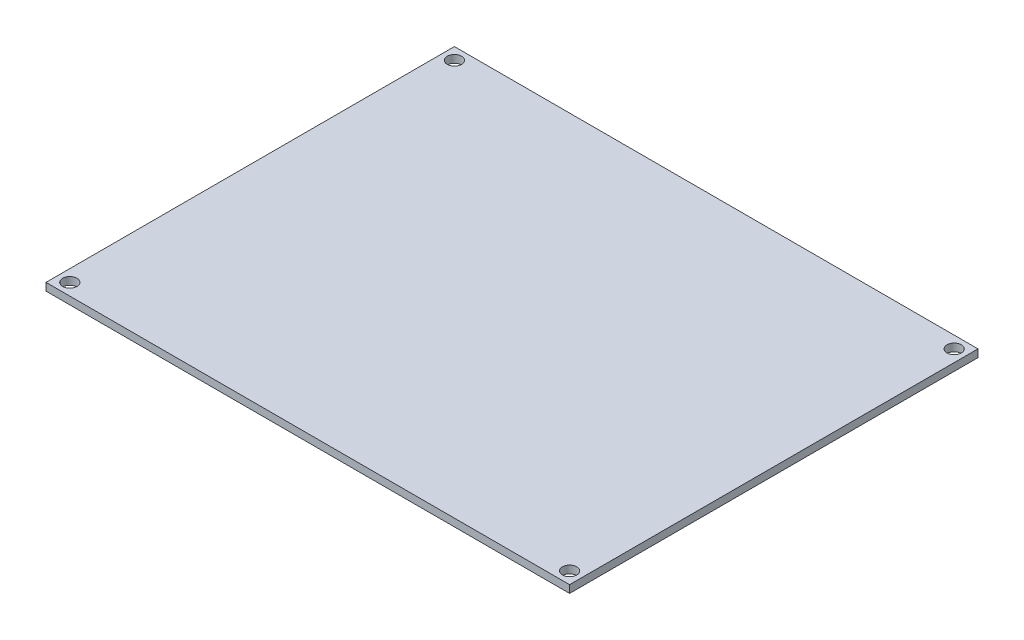
ISO-10303-21;
HEADER;
FILE_DESCRIPTION(('STEP AP214'),'2;1');
FILE_NAME('part.step','',(''),(''),'','','');
FILE_SCHEMA(('AUTOMOTIVE_DESIGN { 1 0 10303 214 1 1 1 1 }'));
ENDSEC;
DATA;
#1=APPLICATION_CONTEXT('core data for automotive mechanical design processes');
#2=APPLICATION_PROTOCOL_DEFINITION('international standard','automotive_design',2000,#1);
#3=PRODUCT_CONTEXT('',#1,'mechanical');
#4=PRODUCT('Part','Part','',(#3));
#5=PRODUCT_RELATED_PRODUCT_CATEGORY('part','',(#4));
#6=PRODUCT_DEFINITION_FORMATION('','',#4);
#7=PRODUCT_DEFINITION_CONTEXT('part definition',#1,'design');
#8=PRODUCT_DEFINITION('design','',#6,#7);
#9=PRODUCT_DEFINITION_SHAPE('','',#8);
#10=(LENGTH_UNIT() NAMED_UNIT(*) SI_UNIT(.MILLI.,.METRE.));
#11=(NAMED_UNIT(*) PLANE_ANGLE_UNIT() SI_UNIT($,.RADIAN.));
#12=(NAMED_UNIT(*) SI_UNIT($,.STERADIAN.) SOLID_ANGLE_UNIT());
#13=UNCERTAINTY_MEASURE_WITH_UNIT(LENGTH_MEASURE(1.E-05),#10,'distance_accuracy_value','');
#14=(GEOMETRIC_REPRESENTATION_CONTEXT(3) GLOBAL_UNCERTAINTY_ASSIGNED_CONTEXT((#13)) GLOBAL_UNIT_ASSIGNED_CONTEXT((#10,
#11,#12)) REPRESENTATION_CONTEXT('',''));
#15=CARTESIAN_POINT('',(0.,0.,0.));
#16=DIRECTION('',(0.,0.,1.));
#17=DIRECTION('',(1.,0.,0.));
#18=AXIS2_PLACEMENT_3D('',#15,#16,#17);
#19=CARTESIAN_POINT('',(0.,1.6,0.));
#20=DIRECTION('',(0.,-1.,0.));
#21=DIRECTION('',(0.,0.,-1.));
#22=AXIS2_PLACEMENT_3D('',#19,#20,#21);
#23=PLANE('',#22);
#24=DIRECTION('',(0.,0.,-1.));
#25=VECTOR('',#24,1.);
#26=CARTESIAN_POINT('',(55.,1.6,42.9));
#27=LINE('',#26,#25);
#28=CARTESIAN_POINT('',(55.,1.6,42.9));
#29=VERTEX_POINT('',#28);
#30=CARTESIAN_POINT('',(55.,1.6,-42.9));
#31=VERTEX_POINT('',#30);
#32=EDGE_CURVE('E85',#29,#31,#27,.T.);
#33=ORIENTED_EDGE('',*,*,#32,.T.);
#34=DIRECTION('',(-1.,0.,0.));
#35=VECTOR('',#34,1.);
#36=CARTESIAN_POINT('',(-55.,1.6,-42.9));
#37=LINE('',#36,#35);
#38=CARTESIAN_POINT('',(-55.,1.6,-42.9));
#39=VERTEX_POINT('',#38);
#40=EDGE_CURVE('E80',#31,#39,#37,.T.);
#41=ORIENTED_EDGE('',*,*,#40,.T.);
#42=DIRECTION('',(0.,0.,1.));
#43=VECTOR('',#42,1.);
#44=CARTESIAN_POINT('',(-55.,1.6,42.9));
#45=LINE('',#44,#43);
#46=CARTESIAN_POINT('',(-55.,1.6,42.9));
#47=VERTEX_POINT('',#46);
#48=EDGE_CURVE('E83',#39,#47,#45,.T.);
#49=ORIENTED_EDGE('',*,*,#48,.T.);
#50=DIRECTION('',(1.,0.,0.));
#51=VECTOR('',#50,1.);
#52=CARTESIAN_POINT('',(-55.,1.6,42.9));
#53=LINE('',#52,#51);
#54=EDGE_CURVE('E50',#47,#29,#53,.T.);
#55=ORIENTED_EDGE('',*,*,#54,.T.);
#56=EDGE_LOOP('',(#33,#41,#49,#55));
#57=FACE_BOUND('',#56,.T.);
#58=CARTESIAN_POINT('',(-52.5,1.6,-40.4));
#59=DIRECTION('',(0.,1.,0.));
#60=DIRECTION('',(0.,0.,1.));
#61=AXIS2_PLACEMENT_3D('',#58,#59,#60);
#62=CIRCLE('',#61,1.5);
#63=CARTESIAN_POINT('',(-52.5,1.6,-38.9));
#64=VERTEX_POINT('',#63);
#65=EDGE_CURVE('E100',#64,#64,#62,.T.);
#66=ORIENTED_EDGE('',*,*,#65,.F.);
#67=EDGE_LOOP('',(#66));
#68=FACE_BOUND('',#67,.T.);
#69=CARTESIAN_POINT('',(52.5,1.6,-40.4));
#70=DIRECTION('',(0.,1.,0.));
#71=DIRECTION('',(0.,0.,-1.));
#72=AXIS2_PLACEMENT_3D('',#69,#70,#71);
#73=CIRCLE('',#72,1.5);
#74=CARTESIAN_POINT('',(52.5,1.6,-41.9));
#75=VERTEX_POINT('',#74);
#76=EDGE_CURVE('E115',#75,#75,#73,.T.);
#77=ORIENTED_EDGE('',*,*,#76,.F.);
#78=EDGE_LOOP('',(#77));
#79=FACE_BOUND('',#78,.T.);
#80=CARTESIAN_POINT('',(52.5,1.6,40.4));
#81=DIRECTION('',(0.,1.,0.));
#82=DIRECTION('',(0.,0.,1.));
#83=AXIS2_PLACEMENT_3D('',#80,#81,#82);
#84=CIRCLE('',#83,1.5);
#85=CARTESIAN_POINT('',(52.5,1.6,41.9));
#86=VERTEX_POINT('',#85);
#87=EDGE_CURVE('E121',#86,#86,#84,.T.);
#88=ORIENTED_EDGE('',*,*,#87,.F.);
#89=EDGE_LOOP('',(#88));
#90=FACE_BOUND('',#89,.T.);
#91=CARTESIAN_POINT('',(-52.5,1.6,40.4));
#92=DIRECTION('',(0.,1.,0.));
#93=DIRECTION('',(0.,0.,-1.));
#94=AXIS2_PLACEMENT_3D('',#91,#92,#93);
#95=CIRCLE('',#94,1.5);
#96=CARTESIAN_POINT('',(-52.5,1.6,38.9));
#97=VERTEX_POINT('',#96);
#98=EDGE_CURVE('E127',#97,#97,#95,.T.);
#99=ORIENTED_EDGE('',*,*,#98,.F.);
#100=EDGE_LOOP('',(#99));
#101=FACE_BOUND('',#100,.T.);
#102=ADVANCED_FACE('F33',(#57,#68,#79,#90,#101),#23,.F.);
#103=CARTESIAN_POINT('',(0.,0.,0.));
#104=DIRECTION('',(0.,-1.,0.));
#105=DIRECTION('',(0.,0.,-1.));
#106=AXIS2_PLACEMENT_3D('',#103,#104,#105);
#107=PLANE('',#106);
#108=CARTESIAN_POINT('',(52.5,0.,40.4));
#109=DIRECTION('',(0.,1.,0.));
#110=DIRECTION('',(0.,0.,1.));
#111=AXIS2_PLACEMENT_3D('',#108,#109,#110);
#112=CIRCLE('',#111,1.5);
#113=CARTESIAN_POINT('',(52.5,0.,41.9));
#114=VERTEX_POINT('',#113);
#115=EDGE_CURVE('E124',#114,#114,#112,.T.);
#116=ORIENTED_EDGE('',*,*,#115,.T.);
#117=EDGE_LOOP('',(#116));
#118=FACE_BOUND('',#117,.T.);
#119=CARTESIAN_POINT('',(-52.5,0.,-40.4));
#120=DIRECTION('',(0.,1.,0.));
#121=DIRECTION('',(0.,0.,1.));
#122=AXIS2_PLACEMENT_3D('',#119,#120,#121);
#123=CIRCLE('',#122,1.5);
#124=CARTESIAN_POINT('',(-52.5,0.,-38.9));
#125=VERTEX_POINT('',#124);
#126=EDGE_CURVE('E112',#125,#125,#123,.T.);
#127=ORIENTED_EDGE('',*,*,#126,.T.);
#128=EDGE_LOOP('',(#127));
#129=FACE_BOUND('',#128,.T.);
#130=DIRECTION('',(0.,0.,-1.));
#131=VECTOR('',#130,1.);
#132=CARTESIAN_POINT('',(55.,0.,42.9));
#133=LINE('',#132,#131);
#134=CARTESIAN_POINT('',(55.,0.,42.9));
#135=VERTEX_POINT('',#134);
#136=CARTESIAN_POINT('',(55.,0.,-42.9));
#137=VERTEX_POINT('',#136);
#138=EDGE_CURVE('E97',#135,#137,#133,.T.);
#139=ORIENTED_EDGE('',*,*,#138,.F.);
#140=DIRECTION('',(1.,0.,0.));
#141=VECTOR('',#140,1.);
#142=CARTESIAN_POINT('',(-55.,0.,42.9));
#143=LINE('',#142,#141);
#144=CARTESIAN_POINT('',(-55.,0.,42.9));
#145=VERTEX_POINT('',#144);
#146=EDGE_CURVE('E73',#145,#135,#143,.T.);
#147=ORIENTED_EDGE('',*,*,#146,.F.);
#148=DIRECTION('',(0.,0.,1.));
#149=VECTOR('',#148,1.);
#150=CARTESIAN_POINT('',(-55.,0.,42.9));
#151=LINE('',#150,#149);
#152=CARTESIAN_POINT('',(-55.,0.,-42.9));
#153=VERTEX_POINT('',#152);
#154=EDGE_CURVE('E67',#153,#145,#151,.T.);
#155=ORIENTED_EDGE('',*,*,#154,.F.);
#156=DIRECTION('',(-1.,0.,0.));
#157=VECTOR('',#156,1.);
#158=CARTESIAN_POINT('',(-55.,0.,-42.9));
#159=LINE('',#158,#157);
#160=EDGE_CURVE('E89',#137,#153,#159,.T.);
#161=ORIENTED_EDGE('',*,*,#160,.F.);
#162=EDGE_LOOP('',(#139,#147,#155,#161));
#163=FACE_BOUND('',#162,.T.);
#164=CARTESIAN_POINT('',(52.5,0.,-40.4));
#165=DIRECTION('',(0.,1.,0.));
#166=DIRECTION('',(0.,0.,-1.));
#167=AXIS2_PLACEMENT_3D('',#164,#165,#166);
#168=CIRCLE('',#167,1.5);
#169=CARTESIAN_POINT('',(52.5,0.,-41.9));
#170=VERTEX_POINT('',#169);
#171=EDGE_CURVE('E118',#170,#170,#168,.T.);
#172=ORIENTED_EDGE('',*,*,#171,.T.);
#173=EDGE_LOOP('',(#172));
#174=FACE_BOUND('',#173,.T.);
#175=CARTESIAN_POINT('',(-52.5,0.,40.4));
#176=DIRECTION('',(0.,1.,0.));
#177=DIRECTION('',(0.,0.,-1.));
#178=AXIS2_PLACEMENT_3D('',#175,#176,#177);
#179=CIRCLE('',#178,1.5);
#180=CARTESIAN_POINT('',(-52.5,0.,38.9));
#181=VERTEX_POINT('',#180);
#182=EDGE_CURVE('E130',#181,#181,#179,.T.);
#183=ORIENTED_EDGE('',*,*,#182,.T.);
#184=EDGE_LOOP('',(#183));
#185=FACE_BOUND('',#184,.T.);
#186=ADVANCED_FACE('F108',(#118,#129,#163,#174,#185),#107,.T.);
#187=CARTESIAN_POINT('',(55.,1.6,42.9));
#188=DIRECTION('',(-1.,0.,0.));
#189=DIRECTION('',(0.,0.,1.));
#190=AXIS2_PLACEMENT_3D('',#187,#188,#189);
#191=PLANE('',#190);
#192=ORIENTED_EDGE('',*,*,#138,.T.);
#193=DIRECTION('',(0.,-1.,0.));
#194=VECTOR('',#193,1.);
#195=CARTESIAN_POINT('',(55.,1.6,-42.9));
#196=LINE('',#195,#194);
#197=EDGE_CURVE('E11',#31,#137,#196,.T.);
#198=ORIENTED_EDGE('',*,*,#197,.F.);
#199=ORIENTED_EDGE('',*,*,#32,.F.);
#200=DIRECTION('',(0.,-1.,0.));
#201=VECTOR('',#200,1.);
#202=CARTESIAN_POINT('',(55.,1.6,42.9));
#203=LINE('',#202,#201);
#204=EDGE_CURVE('E93',#29,#135,#203,.T.);
#205=ORIENTED_EDGE('',*,*,#204,.T.);
#206=EDGE_LOOP('',(#192,#198,#199,#205));
#207=FACE_BOUND('',#206,.T.);
#208=ADVANCED_FACE('F35',(#207),#191,.F.);
#209=CARTESIAN_POINT('',(-55.,1.6,-42.9));
#210=DIRECTION('',(0.,0.,1.));
#211=DIRECTION('',(1.,0.,0.));
#212=AXIS2_PLACEMENT_3D('',#209,#210,#211);
#213=PLANE('',#212);
#214=ORIENTED_EDGE('',*,*,#160,.T.);
#215=DIRECTION('',(0.,-1.,0.));
#216=VECTOR('',#215,1.);
#217=CARTESIAN_POINT('',(-55.,1.6,-42.9));
#218=LINE('',#217,#216);
#219=EDGE_CURVE('E42',#39,#153,#218,.T.);
#220=ORIENTED_EDGE('',*,*,#219,.F.);
#221=ORIENTED_EDGE('',*,*,#40,.F.);
#222=ORIENTED_EDGE('',*,*,#197,.T.);
#223=EDGE_LOOP('',(#214,#220,#221,#222));
#224=FACE_BOUND('',#223,.T.);
#225=ADVANCED_FACE('F88',(#224),#213,.F.);
#226=CARTESIAN_POINT('',(-55.,1.6,42.9));
#227=DIRECTION('',(1.,0.,0.));
#228=DIRECTION('',(0.,0.,-1.));
#229=AXIS2_PLACEMENT_3D('',#226,#227,#228);
#230=PLANE('',#229);
#231=ORIENTED_EDGE('',*,*,#154,.T.);
#232=DIRECTION('',(0.,-1.,0.));
#233=VECTOR('',#232,1.);
#234=CARTESIAN_POINT('',(-55.,1.6,42.9));
#235=LINE('',#234,#233);
#236=EDGE_CURVE('E90',#47,#145,#235,.T.);
#237=ORIENTED_EDGE('',*,*,#236,.F.);
#238=ORIENTED_EDGE('',*,*,#48,.F.);
#239=ORIENTED_EDGE('',*,*,#219,.T.);
#240=EDGE_LOOP('',(#231,#237,#238,#239));
#241=FACE_BOUND('',#240,.T.);
#242=ADVANCED_FACE('F91',(#241),#230,.F.);
#243=CARTESIAN_POINT('',(-55.,1.6,42.9));
#244=DIRECTION('',(0.,0.,-1.));
#245=DIRECTION('',(-1.,0.,0.));
#246=AXIS2_PLACEMENT_3D('',#243,#244,#245);
#247=PLANE('',#246);
#248=ORIENTED_EDGE('',*,*,#146,.T.);
#249=ORIENTED_EDGE('',*,*,#204,.F.);
#250=ORIENTED_EDGE('',*,*,#54,.F.);
#251=ORIENTED_EDGE('',*,*,#236,.T.);
#252=EDGE_LOOP('',(#248,#249,#250,#251));
#253=FACE_BOUND('',#252,.T.);
#254=ADVANCED_FACE('F105',(#253),#247,.F.);
#255=CARTESIAN_POINT('',(-52.5,1.6,-40.4));
#256=DIRECTION('',(0.,-1.,0.));
#257=DIRECTION('',(0.,0.,-1.));
#258=AXIS2_PLACEMENT_3D('',#255,#256,#257);
#259=CYLINDRICAL_SURFACE('',#258,1.5);
#260=ORIENTED_EDGE('',*,*,#65,.T.);
#261=EDGE_LOOP('',(#260));
#262=FACE_BOUND('',#261,.T.);
#263=ORIENTED_EDGE('',*,*,#126,.F.);
#264=EDGE_LOOP('',(#263));
#265=FACE_BOUND('',#264,.T.);
#266=ADVANCED_FACE('F147',(#262,#265),#259,.F.);
#267=CARTESIAN_POINT('',(52.5,1.6,-40.4));
#268=DIRECTION('',(0.,-1.,0.));
#269=DIRECTION('',(0.,0.,-1.));
#270=AXIS2_PLACEMENT_3D('',#267,#268,#269);
#271=CYLINDRICAL_SURFACE('',#270,1.5);
#272=ORIENTED_EDGE('',*,*,#76,.T.);
#273=EDGE_LOOP('',(#272));
#274=FACE_BOUND('',#273,.T.);
#275=ORIENTED_EDGE('',*,*,#171,.F.);
#276=EDGE_LOOP('',(#275));
#277=FACE_BOUND('',#276,.T.);
#278=ADVANCED_FACE('F193',(#274,#277),#271,.F.);
#279=CARTESIAN_POINT('',(52.5,1.6,40.4));
#280=DIRECTION('',(0.,-1.,0.));
#281=DIRECTION('',(0.,0.,-1.));
#282=AXIS2_PLACEMENT_3D('',#279,#280,#281);
#283=CYLINDRICAL_SURFACE('',#282,1.5);
#284=ORIENTED_EDGE('',*,*,#87,.T.);
#285=EDGE_LOOP('',(#284));
#286=FACE_BOUND('',#285,.T.);
#287=ORIENTED_EDGE('',*,*,#115,.F.);
#288=EDGE_LOOP('',(#287));
#289=FACE_BOUND('',#288,.T.);
#290=ADVANCED_FACE('F201',(#286,#289),#283,.F.);
#291=CARTESIAN_POINT('',(-52.5,1.6,40.4));
#292=DIRECTION('',(0.,-1.,0.));
#293=DIRECTION('',(0.,0.,-1.));
#294=AXIS2_PLACEMENT_3D('',#291,#292,#293);
#295=CYLINDRICAL_SURFACE('',#294,1.5);
#296=ORIENTED_EDGE('',*,*,#98,.T.);
#297=EDGE_LOOP('',(#296));
#298=FACE_BOUND('',#297,.T.);
#299=ORIENTED_EDGE('',*,*,#182,.F.);
#300=EDGE_LOOP('',(#299));
#301=FACE_BOUND('',#300,.T.);
#302=ADVANCED_FACE('F136',(#298,#301),#295,.F.);
#303=CLOSED_SHELL('',(#102,#186,#208,#225,#242,#254,#266,#278,#290,#302));
#304=MANIFOLD_SOLID_BREP('B2',#303);
#305=ADVANCED_BREP_SHAPE_REPRESENTATION('',(#18,#304),#14);
#306=SHAPE_DEFINITION_REPRESENTATION(#9,#305);
ENDSEC;
END-ISO-10303-21;
